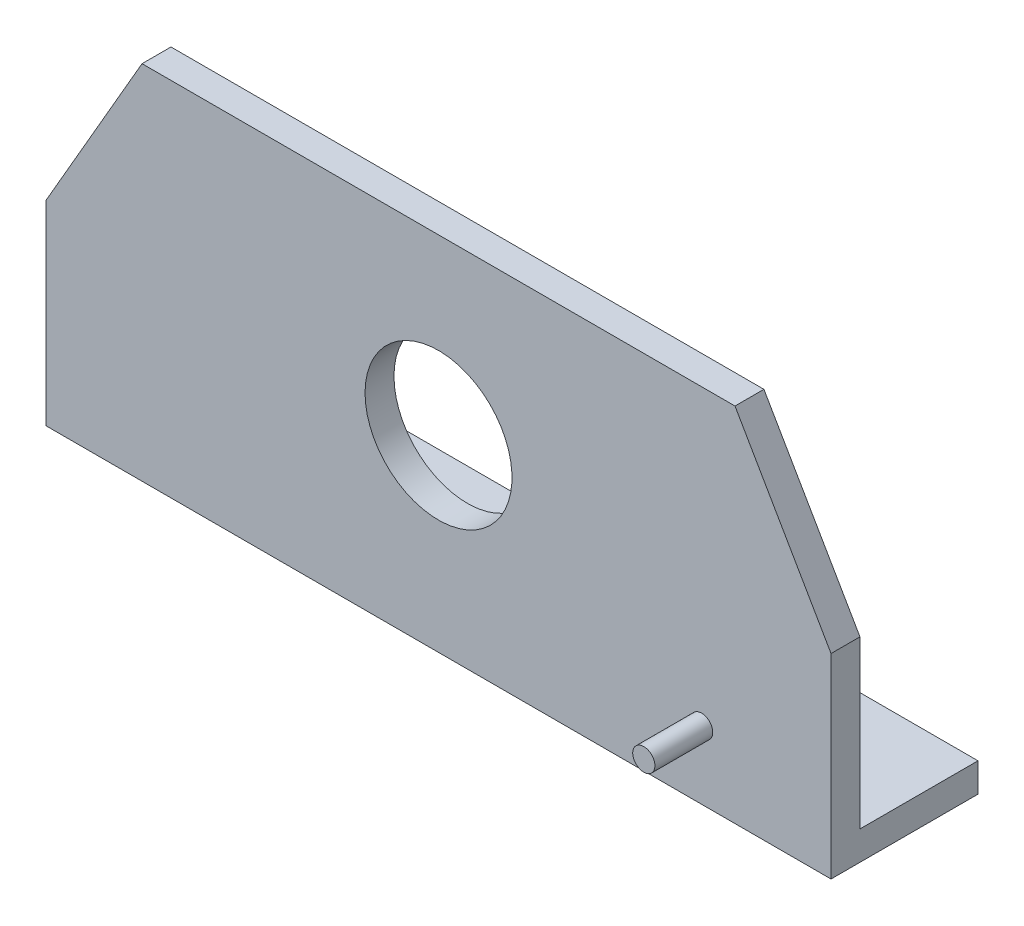
ISO-10303-21;
HEADER;
FILE_DESCRIPTION(('STEP AP214'),'2;1');
FILE_NAME('part.step','',(''),(''),'','','');
FILE_SCHEMA(('AUTOMOTIVE_DESIGN { 1 0 10303 214 1 1 1 1 }'));
ENDSEC;
DATA;
#1=APPLICATION_CONTEXT('core data for automotive mechanical design processes');
#2=APPLICATION_PROTOCOL_DEFINITION('international standard','automotive_design',2000,#1);
#3=PRODUCT_CONTEXT('',#1,'mechanical');
#4=PRODUCT('Part','Part','',(#3));
#5=PRODUCT_RELATED_PRODUCT_CATEGORY('part','',(#4));
#6=PRODUCT_DEFINITION_FORMATION('','',#4);
#7=PRODUCT_DEFINITION_CONTEXT('part definition',#1,'design');
#8=PRODUCT_DEFINITION('design','',#6,#7);
#9=PRODUCT_DEFINITION_SHAPE('','',#8);
#10=(LENGTH_UNIT() NAMED_UNIT(*) SI_UNIT(.MILLI.,.METRE.));
#11=(NAMED_UNIT(*) PLANE_ANGLE_UNIT() SI_UNIT($,.RADIAN.));
#12=(NAMED_UNIT(*) SI_UNIT($,.STERADIAN.) SOLID_ANGLE_UNIT());
#13=UNCERTAINTY_MEASURE_WITH_UNIT(LENGTH_MEASURE(1.E-05),#10,'distance_accuracy_value','');
#14=(GEOMETRIC_REPRESENTATION_CONTEXT(3) GLOBAL_UNCERTAINTY_ASSIGNED_CONTEXT((#13)) GLOBAL_UNIT_ASSIGNED_CONTEXT((#10,
#11,#12)) REPRESENTATION_CONTEXT('',''));
#15=CARTESIAN_POINT('',(0.,0.,0.));
#16=DIRECTION('',(0.,0.,1.));
#17=DIRECTION('',(1.,0.,0.));
#18=AXIS2_PLACEMENT_3D('',#15,#16,#17);
#19=CARTESIAN_POINT('',(45.4797938979355,9.22803019377463,15.));
#20=DIRECTION('',(0.,0.,1.));
#21=DIRECTION('',(1.,0.,0.));
#22=AXIS2_PLACEMENT_3D('',#19,#20,#21);
#23=PLANE('',#22);
#24=CARTESIAN_POINT('',(45.4797938979355,9.22803019377463,15.));
#25=DIRECTION('',(0.,0.,-1.));
#26=DIRECTION('',(-1.,0.,0.));
#27=AXIS2_PLACEMENT_3D('',#24,#25,#26);
#28=CIRCLE('',#27,1.91824289395922);
#29=CARTESIAN_POINT('',(43.5615510039763,9.22803019377463,15.));
#30=VERTEX_POINT('',#29);
#31=EDGE_CURVE('E20',#30,#30,#28,.T.);
#32=ORIENTED_EDGE('',*,*,#31,.F.);
#33=EDGE_LOOP('',(#32));
#34=FACE_BOUND('',#33,.T.);
#35=ADVANCED_FACE('F17',(#34),#23,.T.);
#36=CARTESIAN_POINT('',(0.,0.,-20.4));
#37=DIRECTION('',(0.,0.,1.));
#38=DIRECTION('',(1.,0.,0.));
#39=AXIS2_PLACEMENT_3D('',#36,#37,#38);
#40=PLANE('',#39);
#41=DIRECTION('',(1.,0.,0.));
#42=VECTOR('',#41,1.);
#43=CARTESIAN_POINT('',(-67.8397938979355,2.49803019377464,-20.4));
#44=LINE('',#43,#42);
#45=CARTESIAN_POINT('',(67.8397938979355,2.49803019377464,-20.4));
#46=VERTEX_POINT('',#45);
#47=CARTESIAN_POINT('',(-67.8397938979355,2.49803019377464,-20.4));
#48=VERTEX_POINT('',#47);
#49=EDGE_CURVE('E110',#46,#48,#44,.F.);
#50=ORIENTED_EDGE('',*,*,#49,.F.);
#51=DIRECTION('',(0.,1.,0.));
#52=VECTOR('',#51,1.);
#53=CARTESIAN_POINT('',(67.8397938979355,2.49803019377464,-20.4));
#54=LINE('',#53,#52);
#55=CARTESIAN_POINT('',(67.8397938979355,-2.50196980622536,-20.4));
#56=VERTEX_POINT('',#55);
#57=EDGE_CURVE('E132',#56,#46,#54,.T.);
#58=ORIENTED_EDGE('',*,*,#57,.F.);
#59=DIRECTION('',(1.,0.,0.));
#60=VECTOR('',#59,1.);
#61=CARTESIAN_POINT('',(-67.8397938979355,-2.50196980622536,-20.4));
#62=LINE('',#61,#60);
#63=CARTESIAN_POINT('',(-67.8397938979355,-2.50196980622536,-20.4));
#64=VERTEX_POINT('',#63);
#65=EDGE_CURVE('E138',#64,#56,#62,.T.);
#66=ORIENTED_EDGE('',*,*,#65,.F.);
#67=DIRECTION('',(0.,1.,0.));
#68=VECTOR('',#67,1.);
#69=CARTESIAN_POINT('',(-67.8397938979355,2.49803019377464,-20.4));
#70=LINE('',#69,#68);
#71=EDGE_CURVE('E143',#48,#64,#70,.F.);
#72=ORIENTED_EDGE('',*,*,#71,.F.);
#73=EDGE_LOOP('',(#50,#58,#66,#72));
#74=FACE_BOUND('',#73,.T.);
#75=ADVANCED_FACE('F176',(#74),#40,.F.);
#76=CARTESIAN_POINT('',(-67.8397938979355,2.49803019377464,-20.4));
#77=DIRECTION('',(0.,1.,0.));
#78=DIRECTION('',(0.,0.,1.));
#79=AXIS2_PLACEMENT_3D('',#76,#77,#78);
#80=PLANE('',#79);
#81=DIRECTION('',(0.,0.,-1.));
#82=VECTOR('',#81,1.);
#83=CARTESIAN_POINT('',(67.8397938979355,2.49803019377464,-20.4));
#84=LINE('',#83,#82);
#85=CARTESIAN_POINT('',(67.8397938979355,2.49803019377464,0.));
#86=VERTEX_POINT('',#85);
#87=EDGE_CURVE('E129',#46,#86,#84,.F.);
#88=ORIENTED_EDGE('',*,*,#87,.F.);
#89=ORIENTED_EDGE('',*,*,#49,.T.);
#90=DIRECTION('',(0.,0.,1.));
#91=VECTOR('',#90,1.);
#92=CARTESIAN_POINT('',(-67.8397938979355,2.49803019377464,-20.4));
#93=LINE('',#92,#91);
#94=CARTESIAN_POINT('',(-67.8397938979355,2.49803019377464,0.));
#95=VERTEX_POINT('',#94);
#96=EDGE_CURVE('E145',#95,#48,#93,.F.);
#97=ORIENTED_EDGE('',*,*,#96,.F.);
#98=DIRECTION('',(1.,0.,0.));
#99=VECTOR('',#98,1.);
#100=CARTESIAN_POINT('',(0.,2.49803019377464,0.));
#101=LINE('',#100,#99);
#102=EDGE_CURVE('E108',#95,#86,#101,.T.);
#103=ORIENTED_EDGE('',*,*,#102,.T.);
#104=EDGE_LOOP('',(#88,#89,#97,#103));
#105=FACE_BOUND('',#104,.T.);
#106=ADVANCED_FACE('F172',(#105),#80,.T.);
#107=CARTESIAN_POINT('',(0.,0.,0.));
#108=DIRECTION('',(0.,0.,1.));
#109=DIRECTION('',(1.,0.,0.));
#110=AXIS2_PLACEMENT_3D('',#107,#108,#109);
#111=PLANE('',#110);
#112=CARTESIAN_POINT('',(0.,30.,0.));
#113=DIRECTION('',(0.,0.,-1.));
#114=DIRECTION('',(-1.,0.,0.));
#115=AXIS2_PLACEMENT_3D('',#112,#113,#114);
#116=CIRCLE('',#115,12.7);
#117=CARTESIAN_POINT('',(-12.7,30.,0.));
#118=VERTEX_POINT('',#117);
#119=EDGE_CURVE('E115',#118,#118,#116,.F.);
#120=ORIENTED_EDGE('',*,*,#119,.T.);
#121=EDGE_LOOP('',(#120));
#122=FACE_BOUND('',#121,.T.);
#123=DIRECTION('',(0.,1.,0.));
#124=VECTOR('',#123,1.);
#125=CARTESIAN_POINT('',(-67.8397938979355,2.49803019377464,0.));
#126=LINE('',#125,#124);
#127=CARTESIAN_POINT('',(-67.8397938979355,31.2490150968873,0.));
#128=VERTEX_POINT('',#127);
#129=EDGE_CURVE('E88',#128,#95,#126,.F.);
#130=ORIENTED_EDGE('',*,*,#129,.F.);
#131=DIRECTION('',(-0.5,-0.866025403784439,0.));
#132=VECTOR('',#131,1.);
#133=CARTESIAN_POINT('',(-51.2404050246565,60.,0.));
#134=LINE('',#133,#132);
#135=CARTESIAN_POINT('',(-51.2404050246565,60.,0.));
#136=VERTEX_POINT('',#135);
#137=EDGE_CURVE('E80',#136,#128,#134,.T.);
#138=ORIENTED_EDGE('',*,*,#137,.F.);
#139=DIRECTION('',(1.,0.,0.));
#140=VECTOR('',#139,1.);
#141=CARTESIAN_POINT('',(34.6410161513775,60.,0.));
#142=LINE('',#141,#140);
#143=CARTESIAN_POINT('',(51.2404050246565,60.,0.));
#144=VERTEX_POINT('',#143);
#145=EDGE_CURVE('E85',#136,#144,#142,.T.);
#146=ORIENTED_EDGE('',*,*,#145,.T.);
#147=DIRECTION('',(-0.5,0.866025403784439,0.));
#148=VECTOR('',#147,1.);
#149=CARTESIAN_POINT('',(51.2404050246565,60.,0.));
#150=LINE('',#149,#148);
#151=CARTESIAN_POINT('',(67.8397938979355,31.2490150968873,0.));
#152=VERTEX_POINT('',#151);
#153=EDGE_CURVE('E121',#152,#144,#150,.T.);
#154=ORIENTED_EDGE('',*,*,#153,.F.);
#155=DIRECTION('',(0.,1.,0.));
#156=VECTOR('',#155,1.);
#157=CARTESIAN_POINT('',(67.8397938979355,2.49803019377464,0.));
#158=LINE('',#157,#156);
#159=EDGE_CURVE('E127',#86,#152,#158,.T.);
#160=ORIENTED_EDGE('',*,*,#159,.F.);
#161=ORIENTED_EDGE('',*,*,#102,.F.);
#162=EDGE_LOOP('',(#130,#138,#146,#154,#160,#161));
#163=FACE_BOUND('',#162,.T.);
#164=ADVANCED_FACE('F84',(#122,#163),#111,.F.);
#165=CARTESIAN_POINT('',(45.4797938979355,9.22803019377463,15.));
#166=DIRECTION('',(0.,0.,-1.));
#167=DIRECTION('',(-1.,0.,0.));
#168=AXIS2_PLACEMENT_3D('',#165,#166,#167);
#169=CYLINDRICAL_SURFACE('',#168,1.91824289395922);
#170=CARTESIAN_POINT('',(45.4797938979355,9.22803019377463,5.));
#171=DIRECTION('',(0.,0.,-1.));
#172=DIRECTION('',(-1.,0.,0.));
#173=AXIS2_PLACEMENT_3D('',#170,#171,#172);
#174=CIRCLE('',#173,1.91824289395922);
#175=CARTESIAN_POINT('',(43.5615510039763,9.22803019377463,5.));
#176=VERTEX_POINT('',#175);
#177=EDGE_CURVE('E112',#176,#176,#174,.T.);
#178=ORIENTED_EDGE('',*,*,#177,.F.);
#179=EDGE_LOOP('',(#178));
#180=FACE_BOUND('',#179,.T.);
#181=ORIENTED_EDGE('',*,*,#31,.T.);
#182=EDGE_LOOP('',(#181));
#183=FACE_BOUND('',#182,.T.);
#184=ADVANCED_FACE('F250',(#180,#183),#169,.T.);
#185=CARTESIAN_POINT('',(34.6410161513775,60.,5.));
#186=DIRECTION('',(0.,-1.,0.));
#187=DIRECTION('',(1.,0.,0.));
#188=AXIS2_PLACEMENT_3D('',#185,#186,#187);
#189=PLANE('',#188);
#190=DIRECTION('',(0.,0.,1.));
#191=VECTOR('',#190,1.);
#192=CARTESIAN_POINT('',(-51.2404050246565,60.,-66.3975554931159));
#193=LINE('',#192,#191);
#194=CARTESIAN_POINT('',(-51.2404050246565,60.,5.));
#195=VERTEX_POINT('',#194);
#196=EDGE_CURVE('E90',#195,#136,#193,.F.);
#197=ORIENTED_EDGE('',*,*,#196,.F.);
#198=DIRECTION('',(1.,0.,0.));
#199=VECTOR('',#198,1.);
#200=CARTESIAN_POINT('',(0.,60.,5.));
#201=LINE('',#200,#199);
#202=CARTESIAN_POINT('',(51.2404050246565,60.,5.));
#203=VERTEX_POINT('',#202);
#204=EDGE_CURVE('E114',#203,#195,#201,.F.);
#205=ORIENTED_EDGE('',*,*,#204,.F.);
#206=DIRECTION('',(0.,0.,1.));
#207=VECTOR('',#206,1.);
#208=CARTESIAN_POINT('',(51.2404050246565,60.,-66.3975554931159));
#209=LINE('',#208,#207);
#210=EDGE_CURVE('E96',#144,#203,#209,.T.);
#211=ORIENTED_EDGE('',*,*,#210,.F.);
#212=ORIENTED_EDGE('',*,*,#145,.F.);
#213=EDGE_LOOP('',(#197,#205,#211,#212));
#214=FACE_BOUND('',#213,.T.);
#215=ADVANCED_FACE('F93',(#214),#189,.F.);
#216=CARTESIAN_POINT('',(-51.2404050246565,60.,-66.3975554931159));
#217=DIRECTION('',(-0.866025403784439,0.5,0.));
#218=DIRECTION('',(-0.5,-0.866025403784439,0.));
#219=AXIS2_PLACEMENT_3D('',#216,#217,#218);
#220=PLANE('',#219);
#221=DIRECTION('',(-0.5,-0.866025403784439,0.));
#222=VECTOR('',#221,1.);
#223=CARTESIAN_POINT('',(-51.2404050246565,60.,5.));
#224=LINE('',#223,#222);
#225=CARTESIAN_POINT('',(-67.8397938979355,31.2490150968873,5.));
#226=VERTEX_POINT('',#225);
#227=EDGE_CURVE('E101',#195,#226,#224,.T.);
#228=ORIENTED_EDGE('',*,*,#227,.F.);
#229=ORIENTED_EDGE('',*,*,#196,.T.);
#230=ORIENTED_EDGE('',*,*,#137,.T.);
#231=DIRECTION('',(0.,0.,1.));
#232=VECTOR('',#231,1.);
#233=CARTESIAN_POINT('',(-67.8397938979355,31.2490150968873,-20.4));
#234=LINE('',#233,#232);
#235=EDGE_CURVE('E103',#226,#128,#234,.F.);
#236=ORIENTED_EDGE('',*,*,#235,.F.);
#237=EDGE_LOOP('',(#228,#229,#230,#236));
#238=FACE_BOUND('',#237,.T.);
#239=ADVANCED_FACE('F99',(#238),#220,.T.);
#240=CARTESIAN_POINT('',(-67.8397938979355,2.49803019377464,-20.4));
#241=DIRECTION('',(-1.,0.,0.));
#242=DIRECTION('',(0.,0.,1.));
#243=AXIS2_PLACEMENT_3D('',#240,#241,#242);
#244=PLANE('',#243);
#245=ORIENTED_EDGE('',*,*,#71,.T.);
#246=DIRECTION('',(0.,0.,1.));
#247=VECTOR('',#246,1.);
#248=CARTESIAN_POINT('',(-67.8397938979355,-2.50196980622536,-20.4));
#249=LINE('',#248,#247);
#250=CARTESIAN_POINT('',(-67.8397938979355,-2.50196980622536,5.));
#251=VERTEX_POINT('',#250);
#252=EDGE_CURVE('E140',#251,#64,#249,.F.);
#253=ORIENTED_EDGE('',*,*,#252,.F.);
#254=DIRECTION('',(0.,1.,0.));
#255=VECTOR('',#254,1.);
#256=CARTESIAN_POINT('',(-67.8397938979355,0.,5.));
#257=LINE('',#256,#255);
#258=EDGE_CURVE('E152',#226,#251,#257,.F.);
#259=ORIENTED_EDGE('',*,*,#258,.F.);
#260=ORIENTED_EDGE('',*,*,#235,.T.);
#261=ORIENTED_EDGE('',*,*,#129,.T.);
#262=ORIENTED_EDGE('',*,*,#96,.T.);
#263=EDGE_LOOP('',(#245,#253,#259,#260,#261,#262));
#264=FACE_BOUND('',#263,.T.);
#265=ADVANCED_FACE('F148',(#264),#244,.T.);
#266=CARTESIAN_POINT('',(-67.8397938979355,-2.50196980622536,-20.4));
#267=DIRECTION('',(0.,-1.,0.));
#268=DIRECTION('',(1.,0.,0.));
#269=AXIS2_PLACEMENT_3D('',#266,#267,#268);
#270=PLANE('',#269);
#271=ORIENTED_EDGE('',*,*,#65,.T.);
#272=DIRECTION('',(0.,0.,-1.));
#273=VECTOR('',#272,1.);
#274=CARTESIAN_POINT('',(67.8397938979355,-2.50196980622536,-20.4));
#275=LINE('',#274,#273);
#276=CARTESIAN_POINT('',(67.8397938979355,-2.50196980622536,5.));
#277=VERTEX_POINT('',#276);
#278=EDGE_CURVE('E135',#277,#56,#275,.T.);
#279=ORIENTED_EDGE('',*,*,#278,.F.);
#280=DIRECTION('',(1.,0.,0.));
#281=VECTOR('',#280,1.);
#282=CARTESIAN_POINT('',(0.,-2.50196980622536,5.));
#283=LINE('',#282,#281);
#284=EDGE_CURVE('E156',#251,#277,#283,.T.);
#285=ORIENTED_EDGE('',*,*,#284,.F.);
#286=ORIENTED_EDGE('',*,*,#252,.T.);
#287=EDGE_LOOP('',(#271,#279,#285,#286));
#288=FACE_BOUND('',#287,.T.);
#289=ADVANCED_FACE('F178',(#288),#270,.T.);
#290=CARTESIAN_POINT('',(67.8397938979355,2.49803019377464,-20.4));
#291=DIRECTION('',(1.,0.,0.));
#292=DIRECTION('',(0.,0.,-1.));
#293=AXIS2_PLACEMENT_3D('',#290,#291,#292);
#294=PLANE('',#293);
#295=ORIENTED_EDGE('',*,*,#159,.T.);
#296=DIRECTION('',(0.,0.,1.));
#297=VECTOR('',#296,1.);
#298=CARTESIAN_POINT('',(67.8397938979355,31.2490150968873,-66.3975554931159));
#299=LINE('',#298,#297);
#300=CARTESIAN_POINT('',(67.8397938979355,31.2490150968873,5.));
#301=VERTEX_POINT('',#300);
#302=EDGE_CURVE('E35',#301,#152,#299,.F.);
#303=ORIENTED_EDGE('',*,*,#302,.F.);
#304=DIRECTION('',(0.,1.,0.));
#305=VECTOR('',#304,1.);
#306=CARTESIAN_POINT('',(67.8397938979355,0.,5.));
#307=LINE('',#306,#305);
#308=EDGE_CURVE('E164',#277,#301,#307,.T.);
#309=ORIENTED_EDGE('',*,*,#308,.F.);
#310=ORIENTED_EDGE('',*,*,#278,.T.);
#311=ORIENTED_EDGE('',*,*,#57,.T.);
#312=ORIENTED_EDGE('',*,*,#87,.T.);
#313=EDGE_LOOP('',(#295,#303,#309,#310,#311,#312));
#314=FACE_BOUND('',#313,.T.);
#315=ADVANCED_FACE('F168',(#314),#294,.T.);
#316=CARTESIAN_POINT('',(51.2404050246565,60.,-66.3975554931159));
#317=DIRECTION('',(0.866025403784439,0.5,0.));
#318=DIRECTION('',(-0.5,0.866025403784439,0.));
#319=AXIS2_PLACEMENT_3D('',#316,#317,#318);
#320=PLANE('',#319);
#321=DIRECTION('',(-0.5,0.866025403784439,0.));
#322=VECTOR('',#321,1.);
#323=CARTESIAN_POINT('',(67.8397938979355,31.2490150968873,5.));
#324=LINE('',#323,#322);
#325=EDGE_CURVE('E26',#301,#203,#324,.T.);
#326=ORIENTED_EDGE('',*,*,#325,.F.);
#327=ORIENTED_EDGE('',*,*,#302,.T.);
#328=ORIENTED_EDGE('',*,*,#153,.T.);
#329=ORIENTED_EDGE('',*,*,#210,.T.);
#330=EDGE_LOOP('',(#326,#327,#328,#329));
#331=FACE_BOUND('',#330,.T.);
#332=ADVANCED_FACE('F166',(#331),#320,.T.);
#333=CARTESIAN_POINT('',(0.,30.,5.));
#334=DIRECTION('',(0.,0.,-1.));
#335=DIRECTION('',(-1.,0.,0.));
#336=AXIS2_PLACEMENT_3D('',#333,#334,#335);
#337=CYLINDRICAL_SURFACE('',#336,12.7);
#338=CARTESIAN_POINT('',(0.,30.,5.));
#339=DIRECTION('',(0.,0.,-1.));
#340=DIRECTION('',(-1.,0.,0.));
#341=AXIS2_PLACEMENT_3D('',#338,#339,#340);
#342=CIRCLE('',#341,12.7);
#343=CARTESIAN_POINT('',(-12.7,30.,5.));
#344=VERTEX_POINT('',#343);
#345=EDGE_CURVE('E11',#344,#344,#342,.T.);
#346=ORIENTED_EDGE('',*,*,#345,.F.);
#347=EDGE_LOOP('',(#346));
#348=FACE_BOUND('',#347,.T.);
#349=ORIENTED_EDGE('',*,*,#119,.F.);
#350=EDGE_LOOP('',(#349));
#351=FACE_BOUND('',#350,.T.);
#352=ADVANCED_FACE('F189',(#348,#351),#337,.F.);
#353=CARTESIAN_POINT('',(0.,0.,5.));
#354=DIRECTION('',(0.,0.,1.));
#355=DIRECTION('',(1.,0.,0.));
#356=AXIS2_PLACEMENT_3D('',#353,#354,#355);
#357=PLANE('',#356);
#358=ORIENTED_EDGE('',*,*,#345,.T.);
#359=EDGE_LOOP('',(#358));
#360=FACE_BOUND('',#359,.T.);
#361=ORIENTED_EDGE('',*,*,#308,.T.);
#362=ORIENTED_EDGE('',*,*,#325,.T.);
#363=ORIENTED_EDGE('',*,*,#204,.T.);
#364=ORIENTED_EDGE('',*,*,#227,.T.);
#365=ORIENTED_EDGE('',*,*,#258,.T.);
#366=ORIENTED_EDGE('',*,*,#284,.T.);
#367=EDGE_LOOP('',(#361,#362,#363,#364,#365,#366));
#368=FACE_BOUND('',#367,.T.);
#369=ORIENTED_EDGE('',*,*,#177,.T.);
#370=EDGE_LOOP('',(#369));
#371=FACE_BOUND('',#370,.T.);
#372=ADVANCED_FACE('F159',(#360,#368,#371),#357,.T.);
#373=CLOSED_SHELL('',(#35,#75,#106,#164,#184,#215,#239,#265,#289,#315,#332,#352,#372));
#374=MANIFOLD_SOLID_BREP('B1',#373);
#375=ADVANCED_BREP_SHAPE_REPRESENTATION('',(#18,#374),#14);
#376=SHAPE_DEFINITION_REPRESENTATION(#9,#375);
ENDSEC;
END-ISO-10303-21;
